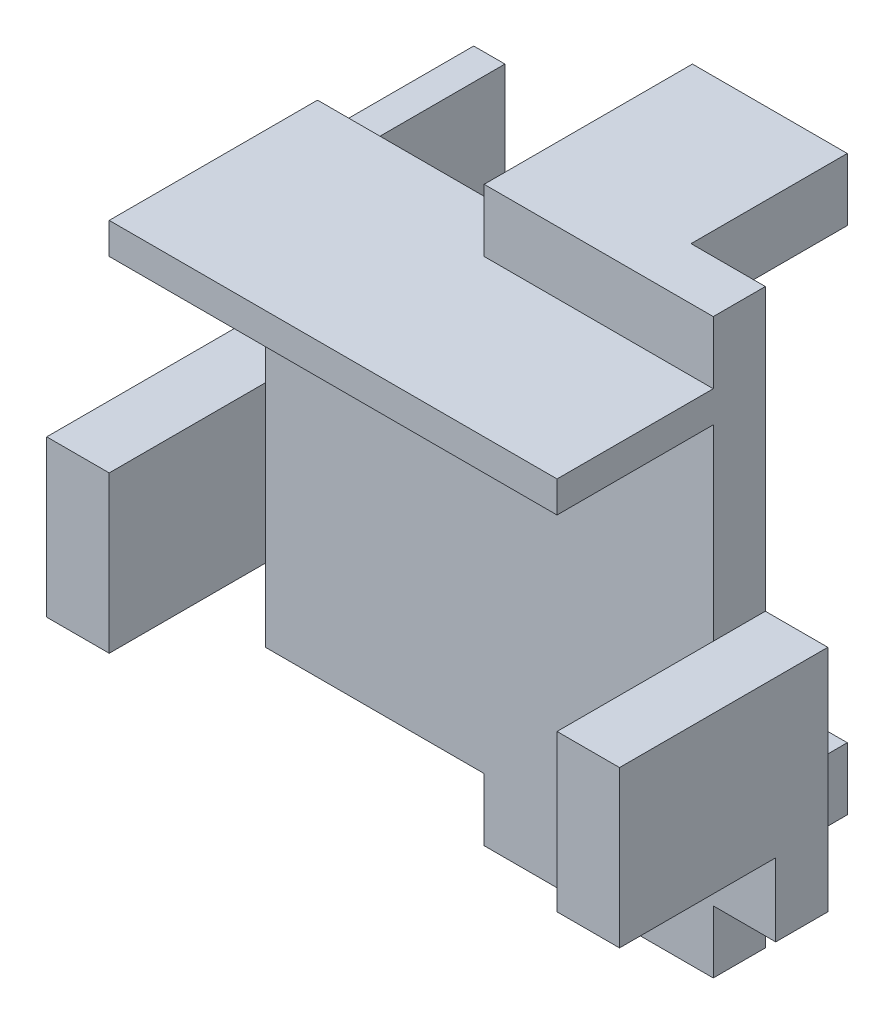
ISO-10303-21;
HEADER;
FILE_DESCRIPTION(('STEP AP214'),'2;1');
FILE_NAME('part.step','',(''),(''),'','','');
FILE_SCHEMA(('AUTOMOTIVE_DESIGN { 1 0 10303 214 1 1 1 1 }'));
ENDSEC;
DATA;
#1=APPLICATION_CONTEXT('core data for automotive mechanical design processes');
#2=APPLICATION_PROTOCOL_DEFINITION('international standard','automotive_design',2000,#1);
#3=PRODUCT_CONTEXT('',#1,'mechanical');
#4=PRODUCT('Part','Part','',(#3));
#5=PRODUCT_RELATED_PRODUCT_CATEGORY('part','',(#4));
#6=PRODUCT_DEFINITION_FORMATION('','',#4);
#7=PRODUCT_DEFINITION_CONTEXT('part definition',#1,'design');
#8=PRODUCT_DEFINITION('design','',#6,#7);
#9=PRODUCT_DEFINITION_SHAPE('','',#8);
#10=(LENGTH_UNIT() NAMED_UNIT(*) SI_UNIT(.MILLI.,.METRE.));
#11=(NAMED_UNIT(*) PLANE_ANGLE_UNIT() SI_UNIT($,.RADIAN.));
#12=(NAMED_UNIT(*) SI_UNIT($,.STERADIAN.) SOLID_ANGLE_UNIT());
#13=UNCERTAINTY_MEASURE_WITH_UNIT(LENGTH_MEASURE(1.E-05),#10,'distance_accuracy_value','');
#14=(GEOMETRIC_REPRESENTATION_CONTEXT(3) GLOBAL_UNCERTAINTY_ASSIGNED_CONTEXT((#13)) GLOBAL_UNIT_ASSIGNED_CONTEXT((#10,
#11,#12)) REPRESENTATION_CONTEXT('',''));
#15=CARTESIAN_POINT('',(0.,0.,0.));
#16=DIRECTION('',(0.,0.,1.));
#17=DIRECTION('',(1.,0.,0.));
#18=AXIS2_PLACEMENT_3D('',#15,#16,#17);
#19=CARTESIAN_POINT('',(0.,0.,-5.));
#20=DIRECTION('',(0.,0.,1.));
#21=DIRECTION('',(1.,0.,0.));
#22=AXIS2_PLACEMENT_3D('',#19,#20,#21);
#23=PLANE('',#22);
#24=DIRECTION('',(1.,0.,0.));
#25=VECTOR('',#24,1.);
#26=CARTESIAN_POINT('',(-50.7969593030904,9.03260576178203,-5.));
#27=LINE('',#26,#25);
#28=CARTESIAN_POINT('',(-50.7969593030904,9.03260576178203,-5.));
#29=VERTEX_POINT('',#28);
#30=CARTESIAN_POINT('',(-35.9278686997028,9.03260576178203,-5.));
#31=VERTEX_POINT('',#30);
#32=EDGE_CURVE('E700',#29,#31,#27,.T.);
#33=ORIENTED_EDGE('',*,*,#32,.F.);
#34=DIRECTION('',(1.,0.,0.));
#35=VECTOR('',#34,1.);
#36=CARTESIAN_POINT('',(0.,9.03260576178203,-5.));
#37=LINE('',#36,#35);
#38=CARTESIAN_POINT('',(-68.7969593030904,9.03260576178203,-5.));
#39=VERTEX_POINT('',#38);
#40=EDGE_CURVE('E370',#39,#29,#37,.T.);
#41=ORIENTED_EDGE('',*,*,#40,.F.);
#42=DIRECTION('',(0.,1.,0.));
#43=VECTOR('',#42,1.);
#44=CARTESIAN_POINT('',(-68.7969593030904,0.,-5.));
#45=LINE('',#44,#43);
#46=CARTESIAN_POINT('',(-68.7969593030904,49.032605761782,-5.));
#47=VERTEX_POINT('',#46);
#48=EDGE_CURVE('E44',#39,#47,#45,.T.);
#49=ORIENTED_EDGE('',*,*,#48,.T.);
#50=DIRECTION('',(-1.,0.,0.));
#51=VECTOR('',#50,1.);
#52=CARTESIAN_POINT('',(0.,49.032605761782,-5.));
#53=LINE('',#52,#51);
#54=CARTESIAN_POINT('',(-71.7969593030904,49.032605761782,-5.));
#55=VERTEX_POINT('',#54);
#56=EDGE_CURVE('E11',#47,#55,#53,.T.);
#57=ORIENTED_EDGE('',*,*,#56,.T.);
#58=DIRECTION('',(0.,1.,0.));
#59=VECTOR('',#58,1.);
#60=CARTESIAN_POINT('',(-71.7969593030904,0.,-5.));
#61=LINE('',#60,#59);
#62=CARTESIAN_POINT('',(-71.7969593030904,52.032605761782,-5.));
#63=VERTEX_POINT('',#62);
#64=EDGE_CURVE('E360',#55,#63,#61,.T.);
#65=ORIENTED_EDGE('',*,*,#64,.T.);
#66=DIRECTION('',(-1.,0.,0.));
#67=VECTOR('',#66,1.);
#68=CARTESIAN_POINT('',(0.,52.032605761782,-5.));
#69=LINE('',#68,#67);
#70=CARTESIAN_POINT('',(-50.7969593030904,52.032605761782,-5.));
#71=VERTEX_POINT('',#70);
#72=EDGE_CURVE('E356',#71,#63,#69,.T.);
#73=ORIENTED_EDGE('',*,*,#72,.F.);
#74=DIRECTION('',(-1.,0.,0.));
#75=VECTOR('',#74,1.);
#76=CARTESIAN_POINT('',(-35.9278686997028,52.032605761782,-5.));
#77=LINE('',#76,#75);
#78=CARTESIAN_POINT('',(-35.9278686997028,52.032605761782,-5.));
#79=VERTEX_POINT('',#78);
#80=EDGE_CURVE('E51',#79,#71,#77,.T.);
#81=ORIENTED_EDGE('',*,*,#80,.F.);
#82=DIRECTION('',(0.,-1.,0.));
#83=VECTOR('',#82,1.);
#84=CARTESIAN_POINT('',(-35.9278686997028,58.032605761782,-5.));
#85=LINE('',#84,#83);
#86=CARTESIAN_POINT('',(-35.9278686997028,58.032605761782,-5.));
#87=VERTEX_POINT('',#86);
#88=EDGE_CURVE('E261',#87,#79,#85,.T.);
#89=ORIENTED_EDGE('',*,*,#88,.F.);
#90=DIRECTION('',(1.,0.,0.));
#91=VECTOR('',#90,1.);
#92=CARTESIAN_POINT('',(0.,58.032605761782,-5.));
#93=LINE('',#92,#91);
#94=CARTESIAN_POINT('',(-28.7969593030904,58.032605761782,-5.));
#95=VERTEX_POINT('',#94);
#96=EDGE_CURVE('E354',#87,#95,#93,.T.);
#97=ORIENTED_EDGE('',*,*,#96,.T.);
#98=DIRECTION('',(0.,-1.,0.));
#99=VECTOR('',#98,1.);
#100=CARTESIAN_POINT('',(-28.7969593030904,0.,-5.));
#101=LINE('',#100,#99);
#102=CARTESIAN_POINT('',(-28.7969593030904,31.032605761782,-5.));
#103=VERTEX_POINT('',#102);
#104=EDGE_CURVE('E386',#95,#103,#101,.T.);
#105=ORIENTED_EDGE('',*,*,#104,.T.);
#106=DIRECTION('',(1.,0.,0.));
#107=VECTOR('',#106,1.);
#108=CARTESIAN_POINT('',(0.,31.032605761782,-5.));
#109=LINE('',#108,#107);
#110=CARTESIAN_POINT('',(-22.7969593030904,31.032605761782,-5.));
#111=VERTEX_POINT('',#110);
#112=EDGE_CURVE('E383',#103,#111,#109,.T.);
#113=ORIENTED_EDGE('',*,*,#112,.T.);
#114=DIRECTION('',(0.,-1.,0.));
#115=VECTOR('',#114,1.);
#116=CARTESIAN_POINT('',(-22.7969593030904,0.,-5.));
#117=LINE('',#116,#115);
#118=CARTESIAN_POINT('',(-22.7969593030904,9.03260576178203,-5.));
#119=VERTEX_POINT('',#118);
#120=EDGE_CURVE('E381',#111,#119,#117,.T.);
#121=ORIENTED_EDGE('',*,*,#120,.T.);
#122=DIRECTION('',(1.,0.,0.));
#123=VECTOR('',#122,1.);
#124=CARTESIAN_POINT('',(0.,9.03260576178203,-5.));
#125=LINE('',#124,#123);
#126=CARTESIAN_POINT('',(-28.7969593030904,9.03260576178203,-5.));
#127=VERTEX_POINT('',#126);
#128=EDGE_CURVE('E378',#127,#119,#125,.T.);
#129=ORIENTED_EDGE('',*,*,#128,.F.);
#130=DIRECTION('',(0.,-1.,0.));
#131=VECTOR('',#130,1.);
#132=CARTESIAN_POINT('',(-28.7969593030904,0.,-5.));
#133=LINE('',#132,#131);
#134=CARTESIAN_POINT('',(-28.7969593030904,3.03260576178203,-5.));
#135=VERTEX_POINT('',#134);
#136=EDGE_CURVE('E375',#127,#135,#133,.T.);
#137=ORIENTED_EDGE('',*,*,#136,.T.);
#138=DIRECTION('',(1.,0.,0.));
#139=VECTOR('',#138,1.);
#140=CARTESIAN_POINT('',(0.,3.03260576178202,-5.));
#141=LINE('',#140,#139);
#142=CARTESIAN_POINT('',(-35.9278686997028,3.03260576178203,-5.));
#143=VERTEX_POINT('',#142);
#144=EDGE_CURVE('E373',#143,#135,#141,.T.);
#145=ORIENTED_EDGE('',*,*,#144,.F.);
#146=DIRECTION('',(0.,-1.,0.));
#147=VECTOR('',#146,1.);
#148=CARTESIAN_POINT('',(-35.9278686997028,9.03260576178203,-5.));
#149=LINE('',#148,#147);
#150=EDGE_CURVE('E254',#31,#143,#149,.T.);
#151=ORIENTED_EDGE('',*,*,#150,.F.);
#152=EDGE_LOOP('',(#33,#41,#49,#57,#65,#73,#81,#89,#97,#105,#113,#121,#129,#137,#145,#151));
#153=FACE_BOUND('',#152,.T.);
#154=ADVANCED_FACE('F36',(#153),#23,.F.);
#155=DIRECTION('',(0.,1.,0.));
#156=VECTOR('',#155,1.);
#157=CARTESIAN_POINT('',(-71.7969593030904,0.,-5.));
#158=LINE('',#157,#156);
#159=CARTESIAN_POINT('',(-71.7969593030904,16.032605761782,-5.));
#160=VERTEX_POINT('',#159);
#161=CARTESIAN_POINT('',(-71.7969593030904,31.032605761782,-5.));
#162=VERTEX_POINT('',#161);
#163=EDGE_CURVE('E447',#160,#162,#158,.T.);
#164=ORIENTED_EDGE('',*,*,#163,.F.);
#165=DIRECTION('',(1.,0.,0.));
#166=VECTOR('',#165,1.);
#167=CARTESIAN_POINT('',(0.,16.032605761782,-5.));
#168=LINE('',#167,#166);
#169=CARTESIAN_POINT('',(-77.7969593030904,16.032605761782,-5.));
#170=VERTEX_POINT('',#169);
#171=EDGE_CURVE('E367',#170,#160,#168,.T.);
#172=ORIENTED_EDGE('',*,*,#171,.F.);
#173=DIRECTION('',(0.,-1.,0.));
#174=VECTOR('',#173,1.);
#175=CARTESIAN_POINT('',(-77.7969593030904,0.,-5.));
#176=LINE('',#175,#174);
#177=CARTESIAN_POINT('',(-77.7969593030904,31.032605761782,-5.));
#178=VERTEX_POINT('',#177);
#179=EDGE_CURVE('E364',#178,#170,#176,.T.);
#180=ORIENTED_EDGE('',*,*,#179,.F.);
#181=DIRECTION('',(1.,0.,0.));
#182=VECTOR('',#181,1.);
#183=CARTESIAN_POINT('',(0.,31.032605761782,-5.));
#184=LINE('',#183,#182);
#185=EDGE_CURVE('E362',#178,#162,#184,.T.);
#186=ORIENTED_EDGE('',*,*,#185,.T.);
#187=EDGE_LOOP('',(#164,#172,#180,#186));
#188=FACE_BOUND('',#187,.T.);
#189=ADVANCED_FACE('F467',(#188),#23,.F.);
#190=CARTESIAN_POINT('',(0.,0.,0.));
#191=DIRECTION('',(0.,0.,1.));
#192=DIRECTION('',(1.,0.,0.));
#193=AXIS2_PLACEMENT_3D('',#190,#191,#192);
#194=PLANE('',#193);
#195=DIRECTION('',(0.,-1.,0.));
#196=VECTOR('',#195,1.);
#197=CARTESIAN_POINT('',(-50.7969593030904,0.,0.));
#198=LINE('',#197,#196);
#199=CARTESIAN_POINT('',(-50.7969593030904,58.032605761782,0.));
#200=VERTEX_POINT('',#199);
#201=CARTESIAN_POINT('',(-50.7969593030904,52.032605761782,0.));
#202=VERTEX_POINT('',#201);
#203=EDGE_CURVE('E391',#200,#202,#198,.T.);
#204=ORIENTED_EDGE('',*,*,#203,.T.);
#205=DIRECTION('',(-1.,0.,0.));
#206=VECTOR('',#205,1.);
#207=CARTESIAN_POINT('',(0.,52.032605761782,0.));
#208=LINE('',#207,#206);
#209=CARTESIAN_POINT('',(-28.7969593030904,52.032605761782,0.));
#210=VERTEX_POINT('',#209);
#211=EDGE_CURVE('E313',#210,#202,#208,.T.);
#212=ORIENTED_EDGE('',*,*,#211,.F.);
#213=DIRECTION('',(0.,-1.,0.));
#214=VECTOR('',#213,1.);
#215=CARTESIAN_POINT('',(-28.7969593030904,0.,0.));
#216=LINE('',#215,#214);
#217=CARTESIAN_POINT('',(-28.7969593030904,58.032605761782,0.));
#218=VERTEX_POINT('',#217);
#219=EDGE_CURVE('E357',#218,#210,#216,.T.);
#220=ORIENTED_EDGE('',*,*,#219,.F.);
#221=DIRECTION('',(1.,0.,0.));
#222=VECTOR('',#221,1.);
#223=CARTESIAN_POINT('',(0.,58.032605761782,0.));
#224=LINE('',#223,#222);
#225=EDGE_CURVE('E353',#200,#218,#224,.T.);
#226=ORIENTED_EDGE('',*,*,#225,.F.);
#227=EDGE_LOOP('',(#204,#212,#220,#226));
#228=FACE_BOUND('',#227,.T.);
#229=ADVANCED_FACE('F490',(#228),#194,.T.);
#230=CARTESIAN_POINT('',(-28.7969593030904,16.032605761782,15.));
#231=DIRECTION('',(0.,1.,0.));
#232=DIRECTION('',(0.,0.,1.));
#233=AXIS2_PLACEMENT_3D('',#230,#231,#232);
#234=PLANE('',#233);
#235=DIRECTION('',(1.,0.,0.));
#236=VECTOR('',#235,1.);
#237=CARTESIAN_POINT('',(-28.7969593030904,16.032605761782,0.));
#238=LINE('',#237,#236);
#239=CARTESIAN_POINT('',(-28.7969593030904,16.032605761782,0.));
#240=VERTEX_POINT('',#239);
#241=CARTESIAN_POINT('',(-22.7969593030904,16.032605761782,0.));
#242=VERTEX_POINT('',#241);
#243=EDGE_CURVE('E438',#240,#242,#238,.T.);
#244=ORIENTED_EDGE('',*,*,#243,.T.);
#245=DIRECTION('',(0.,0.,-1.));
#246=VECTOR('',#245,1.);
#247=CARTESIAN_POINT('',(-22.7969593030904,16.032605761782,15.));
#248=LINE('',#247,#246);
#249=CARTESIAN_POINT('',(-22.7969593030904,16.032605761782,15.));
#250=VERTEX_POINT('',#249);
#251=EDGE_CURVE('E445',#250,#242,#248,.T.);
#252=ORIENTED_EDGE('',*,*,#251,.F.);
#253=DIRECTION('',(1.,0.,0.));
#254=VECTOR('',#253,1.);
#255=CARTESIAN_POINT('',(-28.7969593030904,16.032605761782,15.));
#256=LINE('',#255,#254);
#257=CARTESIAN_POINT('',(-28.7969593030904,16.032605761782,15.));
#258=VERTEX_POINT('',#257);
#259=EDGE_CURVE('E423',#258,#250,#256,.T.);
#260=ORIENTED_EDGE('',*,*,#259,.F.);
#261=DIRECTION('',(0.,0.,-1.));
#262=VECTOR('',#261,1.);
#263=CARTESIAN_POINT('',(-28.7969593030904,16.032605761782,15.));
#264=LINE('',#263,#262);
#265=EDGE_CURVE('E435',#258,#240,#264,.T.);
#266=ORIENTED_EDGE('',*,*,#265,.T.);
#267=EDGE_LOOP('',(#244,#252,#260,#266));
#268=FACE_BOUND('',#267,.T.);
#269=ADVANCED_FACE('F38',(#268),#234,.F.);
#270=CARTESIAN_POINT('',(-22.7969593030904,31.032605761782,15.));
#271=DIRECTION('',(1.,0.,0.));
#272=DIRECTION('',(0.,0.,-1.));
#273=AXIS2_PLACEMENT_3D('',#270,#271,#272);
#274=PLANE('',#273);
#275=ORIENTED_EDGE('',*,*,#251,.T.);
#276=DIRECTION('',(0.,-1.,0.));
#277=VECTOR('',#276,1.);
#278=CARTESIAN_POINT('',(-22.7969593030904,0.,0.));
#279=LINE('',#278,#277);
#280=CARTESIAN_POINT('',(-22.7969593030904,9.03260576178203,0.));
#281=VERTEX_POINT('',#280);
#282=EDGE_CURVE('E414',#242,#281,#279,.T.);
#283=ORIENTED_EDGE('',*,*,#282,.T.);
#284=DIRECTION('',(0.,0.,1.));
#285=VECTOR('',#284,1.);
#286=CARTESIAN_POINT('',(-22.7969593030904,9.03260576178203,-5.));
#287=LINE('',#286,#285);
#288=EDGE_CURVE('E681',#119,#281,#287,.T.);
#289=ORIENTED_EDGE('',*,*,#288,.F.);
#290=ORIENTED_EDGE('',*,*,#120,.F.);
#291=DIRECTION('',(0.,0.,-1.));
#292=VECTOR('',#291,1.);
#293=CARTESIAN_POINT('',(-22.7969593030904,31.032605761782,15.));
#294=LINE('',#293,#292);
#295=CARTESIAN_POINT('',(-22.7969593030904,31.032605761782,15.));
#296=VERTEX_POINT('',#295);
#297=EDGE_CURVE('E443',#296,#111,#294,.T.);
#298=ORIENTED_EDGE('',*,*,#297,.F.);
#299=DIRECTION('',(0.,-1.,0.));
#300=VECTOR('',#299,1.);
#301=CARTESIAN_POINT('',(-22.7969593030904,31.032605761782,15.));
#302=LINE('',#301,#300);
#303=EDGE_CURVE('E425',#296,#250,#302,.T.);
#304=ORIENTED_EDGE('',*,*,#303,.T.);
#305=EDGE_LOOP('',(#275,#283,#289,#290,#298,#304));
#306=FACE_BOUND('',#305,.T.);
#307=ADVANCED_FACE('F718',(#306),#274,.T.);
#308=CARTESIAN_POINT('',(-28.7969593030904,31.032605761782,15.));
#309=DIRECTION('',(0.,1.,0.));
#310=DIRECTION('',(0.,0.,1.));
#311=AXIS2_PLACEMENT_3D('',#308,#309,#310);
#312=PLANE('',#311);
#313=ORIENTED_EDGE('',*,*,#297,.T.);
#314=ORIENTED_EDGE('',*,*,#112,.F.);
#315=DIRECTION('',(0.,0.,1.));
#316=VECTOR('',#315,1.);
#317=CARTESIAN_POINT('',(-28.7969593030904,31.032605761782,-5.));
#318=LINE('',#317,#316);
#319=CARTESIAN_POINT('',(-28.7969593030904,31.032605761782,0.));
#320=VERTEX_POINT('',#319);
#321=EDGE_CURVE('E679',#103,#320,#318,.T.);
#322=ORIENTED_EDGE('',*,*,#321,.T.);
#323=DIRECTION('',(0.,0.,-1.));
#324=VECTOR('',#323,1.);
#325=CARTESIAN_POINT('',(-28.7969593030904,31.032605761782,15.));
#326=LINE('',#325,#324);
#327=CARTESIAN_POINT('',(-28.7969593030904,31.032605761782,15.));
#328=VERTEX_POINT('',#327);
#329=EDGE_CURVE('E440',#328,#320,#326,.T.);
#330=ORIENTED_EDGE('',*,*,#329,.F.);
#331=DIRECTION('',(1.,0.,0.));
#332=VECTOR('',#331,1.);
#333=CARTESIAN_POINT('',(-28.7969593030904,31.032605761782,15.));
#334=LINE('',#333,#332);
#335=EDGE_CURVE('E429',#328,#296,#334,.T.);
#336=ORIENTED_EDGE('',*,*,#335,.T.);
#337=EDGE_LOOP('',(#313,#314,#322,#330,#336));
#338=FACE_BOUND('',#337,.T.);
#339=ADVANCED_FACE('F729',(#338),#312,.T.);
#340=CARTESIAN_POINT('',(-28.7969593030904,16.032605761782,15.));
#341=DIRECTION('',(-1.,0.,0.));
#342=DIRECTION('',(0.,0.,1.));
#343=AXIS2_PLACEMENT_3D('',#340,#341,#342);
#344=PLANE('',#343);
#345=DIRECTION('',(0.,1.,0.));
#346=VECTOR('',#345,1.);
#347=CARTESIAN_POINT('',(-28.7969593030904,16.032605761782,0.));
#348=LINE('',#347,#346);
#349=EDGE_CURVE('E426',#240,#320,#348,.T.);
#350=ORIENTED_EDGE('',*,*,#349,.F.);
#351=ORIENTED_EDGE('',*,*,#265,.F.);
#352=DIRECTION('',(0.,1.,0.));
#353=VECTOR('',#352,1.);
#354=CARTESIAN_POINT('',(-28.7969593030904,16.032605761782,15.));
#355=LINE('',#354,#353);
#356=EDGE_CURVE('E432',#258,#328,#355,.T.);
#357=ORIENTED_EDGE('',*,*,#356,.T.);
#358=ORIENTED_EDGE('',*,*,#329,.T.);
#359=EDGE_LOOP('',(#350,#351,#357,#358));
#360=FACE_BOUND('',#359,.T.);
#361=ADVANCED_FACE('F726',(#360),#344,.T.);
#362=CARTESIAN_POINT('',(0.,0.,15.));
#363=DIRECTION('',(0.,0.,-1.));
#364=DIRECTION('',(-1.,0.,0.));
#365=AXIS2_PLACEMENT_3D('',#362,#363,#364);
#366=PLANE('',#365);
#367=ORIENTED_EDGE('',*,*,#259,.T.);
#368=ORIENTED_EDGE('',*,*,#303,.F.);
#369=ORIENTED_EDGE('',*,*,#335,.F.);
#370=ORIENTED_EDGE('',*,*,#356,.F.);
#371=EDGE_LOOP('',(#367,#368,#369,#370));
#372=FACE_BOUND('',#371,.T.);
#373=ADVANCED_FACE('F518',(#372),#366,.F.);
#374=DIRECTION('',(-1.,0.,0.));
#375=VECTOR('',#374,1.);
#376=CARTESIAN_POINT('',(0.,49.032605761782,0.));
#377=LINE('',#376,#375);
#378=CARTESIAN_POINT('',(-28.7969593030904,49.032605761782,0.));
#379=VERTEX_POINT('',#378);
#380=CARTESIAN_POINT('',(-71.7969593030904,49.032605761782,0.));
#381=VERTEX_POINT('',#380);
#382=EDGE_CURVE('E303',#379,#381,#377,.T.);
#383=ORIENTED_EDGE('',*,*,#382,.T.);
#384=DIRECTION('',(0.,1.,0.));
#385=VECTOR('',#384,1.);
#386=CARTESIAN_POINT('',(-71.7969593030904,0.,0.));
#387=LINE('',#386,#385);
#388=CARTESIAN_POINT('',(-71.7969593030904,31.032605761782,0.));
#389=VERTEX_POINT('',#388);
#390=EDGE_CURVE('E394',#389,#381,#387,.T.);
#391=ORIENTED_EDGE('',*,*,#390,.F.);
#392=DIRECTION('',(0.,-1.,0.));
#393=VECTOR('',#392,1.);
#394=CARTESIAN_POINT('',(-71.7969593030904,0.,0.));
#395=LINE('',#394,#393);
#396=CARTESIAN_POINT('',(-71.7969593030904,16.032605761782,0.));
#397=VERTEX_POINT('',#396);
#398=EDGE_CURVE('E334',#389,#397,#395,.T.);
#399=ORIENTED_EDGE('',*,*,#398,.T.);
#400=DIRECTION('',(0.,1.,0.));
#401=VECTOR('',#400,1.);
#402=CARTESIAN_POINT('',(-71.7969593030904,0.,0.));
#403=LINE('',#402,#401);
#404=CARTESIAN_POINT('',(-71.7969593030904,9.03260576178203,0.));
#405=VERTEX_POINT('',#404);
#406=EDGE_CURVE('E397',#405,#397,#403,.T.);
#407=ORIENTED_EDGE('',*,*,#406,.F.);
#408=DIRECTION('',(1.,0.,0.));
#409=VECTOR('',#408,1.);
#410=CARTESIAN_POINT('',(0.,9.03260576178203,0.));
#411=LINE('',#410,#409);
#412=CARTESIAN_POINT('',(-50.7969593030904,9.03260576178203,0.));
#413=VERTEX_POINT('',#412);
#414=EDGE_CURVE('E400',#405,#413,#411,.T.);
#415=ORIENTED_EDGE('',*,*,#414,.T.);
#416=DIRECTION('',(0.,-1.,0.));
#417=VECTOR('',#416,1.);
#418=CARTESIAN_POINT('',(-50.7969593030904,0.,0.));
#419=LINE('',#418,#417);
#420=CARTESIAN_POINT('',(-50.7969593030904,3.03260576178203,0.));
#421=VERTEX_POINT('',#420);
#422=EDGE_CURVE('E402',#413,#421,#419,.T.);
#423=ORIENTED_EDGE('',*,*,#422,.T.);
#424=DIRECTION('',(1.,0.,0.));
#425=VECTOR('',#424,1.);
#426=CARTESIAN_POINT('',(0.,3.03260576178202,0.));
#427=LINE('',#426,#425);
#428=CARTESIAN_POINT('',(-28.7969593030904,3.03260576178203,0.));
#429=VERTEX_POINT('',#428);
#430=EDGE_CURVE('E405',#421,#429,#427,.T.);
#431=ORIENTED_EDGE('',*,*,#430,.T.);
#432=DIRECTION('',(0.,-1.,0.));
#433=VECTOR('',#432,1.);
#434=CARTESIAN_POINT('',(-28.7969593030904,0.,0.));
#435=LINE('',#434,#433);
#436=CARTESIAN_POINT('',(-28.7969593030904,9.03260576178203,0.));
#437=VERTEX_POINT('',#436);
#438=EDGE_CURVE('E408',#437,#429,#435,.T.);
#439=ORIENTED_EDGE('',*,*,#438,.F.);
#440=DIRECTION('',(1.,0.,0.));
#441=VECTOR('',#440,1.);
#442=CARTESIAN_POINT('',(0.,9.03260576178203,0.));
#443=LINE('',#442,#441);
#444=EDGE_CURVE('E411',#437,#281,#443,.T.);
#445=ORIENTED_EDGE('',*,*,#444,.T.);
#446=ORIENTED_EDGE('',*,*,#282,.F.);
#447=ORIENTED_EDGE('',*,*,#243,.F.);
#448=ORIENTED_EDGE('',*,*,#349,.T.);
#449=EDGE_CURVE('E421',#379,#320,#216,.T.);
#450=ORIENTED_EDGE('',*,*,#449,.F.);
#451=EDGE_LOOP('',(#383,#391,#399,#407,#415,#423,#431,#439,#445,#446,#447,#448,#450));
#452=FACE_BOUND('',#451,.T.);
#453=ADVANCED_FACE('F515',(#452),#194,.T.);
#454=CARTESIAN_POINT('',(0.,58.032605761782,-5.));
#455=DIRECTION('',(0.,-1.,0.));
#456=DIRECTION('',(0.,0.,-1.));
#457=AXIS2_PLACEMENT_3D('',#454,#455,#456);
#458=PLANE('',#457);
#459=ORIENTED_EDGE('',*,*,#225,.T.);
#460=DIRECTION('',(0.,0.,1.));
#461=VECTOR('',#460,1.);
#462=CARTESIAN_POINT('',(-28.7969593030904,58.032605761782,-5.));
#463=LINE('',#462,#461);
#464=EDGE_CURVE('E452',#95,#218,#463,.T.);
#465=ORIENTED_EDGE('',*,*,#464,.F.);
#466=ORIENTED_EDGE('',*,*,#96,.F.);
#467=DIRECTION('',(0.,0.,1.));
#468=VECTOR('',#467,1.);
#469=CARTESIAN_POINT('',(-35.9278686997028,58.032605761782,-20.));
#470=LINE('',#469,#468);
#471=CARTESIAN_POINT('',(-35.9278686997028,58.032605761782,-20.));
#472=VERTEX_POINT('',#471);
#473=EDGE_CURVE('E278',#472,#87,#470,.T.);
#474=ORIENTED_EDGE('',*,*,#473,.F.);
#475=DIRECTION('',(1.,0.,0.));
#476=VECTOR('',#475,1.);
#477=CARTESIAN_POINT('',(-35.9278686997028,58.032605761782,-20.));
#478=LINE('',#477,#476);
#479=CARTESIAN_POINT('',(-50.7969593030904,58.032605761782,-20.));
#480=VERTEX_POINT('',#479);
#481=EDGE_CURVE('E277',#480,#472,#478,.T.);
#482=ORIENTED_EDGE('',*,*,#481,.F.);
#483=DIRECTION('',(0.,0.,1.));
#484=VECTOR('',#483,1.);
#485=CARTESIAN_POINT('',(-50.7969593030904,58.032605761782,-5.));
#486=LINE('',#485,#484);
#487=EDGE_CURVE('E388',#480,#200,#486,.T.);
#488=ORIENTED_EDGE('',*,*,#487,.T.);
#489=EDGE_LOOP('',(#459,#465,#466,#474,#482,#488));
#490=FACE_BOUND('',#489,.T.);
#491=ADVANCED_FACE('F485',(#490),#458,.F.);
#492=CARTESIAN_POINT('',(-28.7969593030904,0.,-5.));
#493=DIRECTION('',(-1.,0.,0.));
#494=DIRECTION('',(0.,-1.,0.));
#495=AXIS2_PLACEMENT_3D('',#492,#493,#494);
#496=PLANE('',#495);
#497=ORIENTED_EDGE('',*,*,#219,.T.);
#498=DIRECTION('',(0.,0.,-1.));
#499=VECTOR('',#498,1.);
#500=CARTESIAN_POINT('',(-28.7969593030904,52.032605761782,15.));
#501=LINE('',#500,#499);
#502=CARTESIAN_POINT('',(-28.7969593030904,52.032605761782,15.));
#503=VERTEX_POINT('',#502);
#504=EDGE_CURVE('E322',#503,#210,#501,.T.);
#505=ORIENTED_EDGE('',*,*,#504,.F.);
#506=DIRECTION('',(0.,-1.,0.));
#507=VECTOR('',#506,1.);
#508=CARTESIAN_POINT('',(-28.7969593030904,0.,15.));
#509=LINE('',#508,#507);
#510=CARTESIAN_POINT('',(-28.7969593030904,49.032605761782,15.));
#511=VERTEX_POINT('',#510);
#512=EDGE_CURVE('E316',#503,#511,#509,.T.);
#513=ORIENTED_EDGE('',*,*,#512,.T.);
#514=DIRECTION('',(0.,0.,-1.));
#515=VECTOR('',#514,1.);
#516=CARTESIAN_POINT('',(-28.7969593030904,49.032605761782,15.));
#517=LINE('',#516,#515);
#518=EDGE_CURVE('E328',#511,#379,#517,.T.);
#519=ORIENTED_EDGE('',*,*,#518,.T.);
#520=ORIENTED_EDGE('',*,*,#449,.T.);
#521=ORIENTED_EDGE('',*,*,#321,.F.);
#522=ORIENTED_EDGE('',*,*,#104,.F.);
#523=ORIENTED_EDGE('',*,*,#464,.T.);
#524=EDGE_LOOP('',(#497,#505,#513,#519,#520,#521,#522,#523));
#525=FACE_BOUND('',#524,.T.);
#526=ADVANCED_FACE('F520',(#525),#496,.F.);
#527=CARTESIAN_POINT('',(0.,9.03260576178203,-5.));
#528=DIRECTION('',(0.,-1.,0.));
#529=DIRECTION('',(0.,0.,-1.));
#530=AXIS2_PLACEMENT_3D('',#527,#528,#529);
#531=PLANE('',#530);
#532=ORIENTED_EDGE('',*,*,#444,.F.);
#533=DIRECTION('',(0.,0.,1.));
#534=VECTOR('',#533,1.);
#535=CARTESIAN_POINT('',(-28.7969593030904,9.03260576178203,-5.));
#536=LINE('',#535,#534);
#537=EDGE_CURVE('E686',#127,#437,#536,.T.);
#538=ORIENTED_EDGE('',*,*,#537,.F.);
#539=ORIENTED_EDGE('',*,*,#128,.T.);
#540=ORIENTED_EDGE('',*,*,#288,.T.);
#541=EDGE_LOOP('',(#532,#538,#539,#540));
#542=FACE_BOUND('',#541,.T.);
#543=ADVANCED_FACE('F523',(#542),#531,.T.);
#544=CARTESIAN_POINT('',(-28.7969593030904,0.,-5.));
#545=DIRECTION('',(-1.,0.,0.));
#546=DIRECTION('',(0.,-1.,0.));
#547=AXIS2_PLACEMENT_3D('',#544,#545,#546);
#548=PLANE('',#547);
#549=ORIENTED_EDGE('',*,*,#438,.T.);
#550=DIRECTION('',(0.,0.,1.));
#551=VECTOR('',#550,1.);
#552=CARTESIAN_POINT('',(-28.7969593030904,3.03260576178203,-5.));
#553=LINE('',#552,#551);
#554=EDGE_CURVE('E688',#135,#429,#553,.T.);
#555=ORIENTED_EDGE('',*,*,#554,.F.);
#556=ORIENTED_EDGE('',*,*,#136,.F.);
#557=ORIENTED_EDGE('',*,*,#537,.T.);
#558=EDGE_LOOP('',(#549,#555,#556,#557));
#559=FACE_BOUND('',#558,.T.);
#560=ADVANCED_FACE('F527',(#559),#548,.F.);
#561=CARTESIAN_POINT('',(0.,3.03260576178202,-5.));
#562=DIRECTION('',(0.,-1.,0.));
#563=DIRECTION('',(1.,0.,0.));
#564=AXIS2_PLACEMENT_3D('',#561,#562,#563);
#565=PLANE('',#564);
#566=ORIENTED_EDGE('',*,*,#430,.F.);
#567=DIRECTION('',(0.,0.,1.));
#568=VECTOR('',#567,1.);
#569=CARTESIAN_POINT('',(-50.7969593030904,3.03260576178203,-5.));
#570=LINE('',#569,#568);
#571=CARTESIAN_POINT('',(-50.7969593030904,3.03260576178203,-20.));
#572=VERTEX_POINT('',#571);
#573=EDGE_CURVE('E690',#572,#421,#570,.T.);
#574=ORIENTED_EDGE('',*,*,#573,.F.);
#575=DIRECTION('',(-1.,0.,0.));
#576=VECTOR('',#575,1.);
#577=CARTESIAN_POINT('',(-50.7969593030904,3.03260576178203,-20.));
#578=LINE('',#577,#576);
#579=CARTESIAN_POINT('',(-35.9278686997028,3.03260576178203,-20.));
#580=VERTEX_POINT('',#579);
#581=EDGE_CURVE('E252',#580,#572,#578,.T.);
#582=ORIENTED_EDGE('',*,*,#581,.F.);
#583=DIRECTION('',(0.,0.,1.));
#584=VECTOR('',#583,1.);
#585=CARTESIAN_POINT('',(-35.9278686997028,3.03260576178203,-20.));
#586=LINE('',#585,#584);
#587=EDGE_CURVE('E265',#580,#143,#586,.T.);
#588=ORIENTED_EDGE('',*,*,#587,.T.);
#589=ORIENTED_EDGE('',*,*,#144,.T.);
#590=ORIENTED_EDGE('',*,*,#554,.T.);
#591=EDGE_LOOP('',(#566,#574,#582,#588,#589,#590));
#592=FACE_BOUND('',#591,.T.);
#593=ADVANCED_FACE('F531',(#592),#565,.T.);
#594=CARTESIAN_POINT('',(-50.7969593030904,0.,-5.));
#595=DIRECTION('',(-1.,0.,0.));
#596=DIRECTION('',(0.,0.,1.));
#597=AXIS2_PLACEMENT_3D('',#594,#595,#596);
#598=PLANE('',#597);
#599=ORIENTED_EDGE('',*,*,#422,.F.);
#600=DIRECTION('',(0.,0.,1.));
#601=VECTOR('',#600,1.);
#602=CARTESIAN_POINT('',(-50.7969593030904,9.03260576178203,-5.));
#603=LINE('',#602,#601);
#604=EDGE_CURVE('E260',#29,#413,#603,.T.);
#605=ORIENTED_EDGE('',*,*,#604,.F.);
#606=DIRECTION('',(0.,0.,1.));
#607=VECTOR('',#606,1.);
#608=CARTESIAN_POINT('',(-50.7969593030904,9.03260576178203,-20.));
#609=LINE('',#608,#607);
#610=CARTESIAN_POINT('',(-50.7969593030904,9.03260576178203,-20.));
#611=VERTEX_POINT('',#610);
#612=EDGE_CURVE('E239',#611,#29,#609,.T.);
#613=ORIENTED_EDGE('',*,*,#612,.F.);
#614=DIRECTION('',(0.,1.,0.));
#615=VECTOR('',#614,1.);
#616=CARTESIAN_POINT('',(-50.7969593030904,9.03260576178203,-20.));
#617=LINE('',#616,#615);
#618=EDGE_CURVE('E246',#572,#611,#617,.T.);
#619=ORIENTED_EDGE('',*,*,#618,.F.);
#620=ORIENTED_EDGE('',*,*,#573,.T.);
#621=EDGE_LOOP('',(#599,#605,#613,#619,#620));
#622=FACE_BOUND('',#621,.T.);
#623=ADVANCED_FACE('F258',(#622),#598,.T.);
#624=CARTESIAN_POINT('',(0.,9.03260576178203,-5.));
#625=DIRECTION('',(0.,-1.,0.));
#626=DIRECTION('',(0.,0.,-1.));
#627=AXIS2_PLACEMENT_3D('',#624,#625,#626);
#628=PLANE('',#627);
#629=ORIENTED_EDGE('',*,*,#604,.T.);
#630=ORIENTED_EDGE('',*,*,#414,.F.);
#631=DIRECTION('',(0.,0.,1.));
#632=VECTOR('',#631,1.);
#633=CARTESIAN_POINT('',(-71.7969593030904,9.03260576178203,-5.));
#634=LINE('',#633,#632);
#635=CARTESIAN_POINT('',(-71.7969593030904,9.03260576178203,-20.));
#636=VERTEX_POINT('',#635);
#637=EDGE_CURVE('E693',#636,#405,#634,.T.);
#638=ORIENTED_EDGE('',*,*,#637,.F.);
#639=DIRECTION('',(-1.,0.,0.));
#640=VECTOR('',#639,1.);
#641=CARTESIAN_POINT('',(-68.7969593030904,9.03260576178203,-20.));
#642=LINE('',#641,#640);
#643=CARTESIAN_POINT('',(-68.7969593030904,9.03260576178203,-20.));
#644=VERTEX_POINT('',#643);
#645=EDGE_CURVE('E293',#644,#636,#642,.T.);
#646=ORIENTED_EDGE('',*,*,#645,.F.);
#647=DIRECTION('',(0.,0.,1.));
#648=VECTOR('',#647,1.);
#649=CARTESIAN_POINT('',(-68.7969593030904,9.03260576178203,-20.));
#650=LINE('',#649,#648);
#651=EDGE_CURVE('E304',#644,#39,#650,.T.);
#652=ORIENTED_EDGE('',*,*,#651,.T.);
#653=ORIENTED_EDGE('',*,*,#40,.T.);
#654=EDGE_LOOP('',(#629,#630,#638,#646,#652,#653));
#655=FACE_BOUND('',#654,.T.);
#656=ADVANCED_FACE('F538',(#655),#628,.T.);
#657=CARTESIAN_POINT('',(-71.7969593030904,0.,-5.));
#658=DIRECTION('',(1.,0.,0.));
#659=DIRECTION('',(0.,0.,-1.));
#660=AXIS2_PLACEMENT_3D('',#657,#658,#659);
#661=PLANE('',#660);
#662=ORIENTED_EDGE('',*,*,#406,.T.);
#663=DIRECTION('',(0.,0.,1.));
#664=VECTOR('',#663,1.);
#665=CARTESIAN_POINT('',(-71.7969593030904,16.032605761782,-5.));
#666=LINE('',#665,#664);
#667=EDGE_CURVE('E464',#160,#397,#666,.T.);
#668=ORIENTED_EDGE('',*,*,#667,.F.);
#669=ORIENTED_EDGE('',*,*,#163,.T.);
#670=DIRECTION('',(0.,0.,1.));
#671=VECTOR('',#670,1.);
#672=CARTESIAN_POINT('',(-71.7969593030904,31.032605761782,-5.));
#673=LINE('',#672,#671);
#674=EDGE_CURVE('E461',#162,#389,#673,.T.);
#675=ORIENTED_EDGE('',*,*,#674,.T.);
#676=ORIENTED_EDGE('',*,*,#390,.T.);
#677=DIRECTION('',(0.,0.,-1.));
#678=VECTOR('',#677,1.);
#679=CARTESIAN_POINT('',(-71.7969593030904,49.032605761782,15.));
#680=LINE('',#679,#678);
#681=CARTESIAN_POINT('',(-71.7969593030904,49.032605761782,15.));
#682=VERTEX_POINT('',#681);
#683=EDGE_CURVE('E331',#682,#381,#680,.T.);
#684=ORIENTED_EDGE('',*,*,#683,.F.);
#685=DIRECTION('',(0.,1.,0.));
#686=VECTOR('',#685,1.);
#687=CARTESIAN_POINT('',(-71.7969593030904,0.,15.));
#688=LINE('',#687,#686);
#689=CARTESIAN_POINT('',(-71.7969593030904,52.032605761782,15.));
#690=VERTEX_POINT('',#689);
#691=EDGE_CURVE('E309',#682,#690,#688,.T.);
#692=ORIENTED_EDGE('',*,*,#691,.T.);
#693=DIRECTION('',(0.,0.,1.));
#694=VECTOR('',#693,1.);
#695=CARTESIAN_POINT('',(-71.7969593030904,52.032605761782,-5.));
#696=LINE('',#695,#694);
#697=EDGE_CURVE('E473',#63,#690,#696,.T.);
#698=ORIENTED_EDGE('',*,*,#697,.F.);
#699=ORIENTED_EDGE('',*,*,#64,.F.);
#700=DIRECTION('',(0.,0.,1.));
#701=VECTOR('',#700,1.);
#702=CARTESIAN_POINT('',(-71.7969593030904,49.032605761782,-20.));
#703=LINE('',#702,#701);
#704=CARTESIAN_POINT('',(-71.7969593030904,49.032605761782,-20.));
#705=VERTEX_POINT('',#704);
#706=EDGE_CURVE('E299',#705,#55,#703,.T.);
#707=ORIENTED_EDGE('',*,*,#706,.F.);
#708=DIRECTION('',(0.,1.,0.));
#709=VECTOR('',#708,1.);
#710=CARTESIAN_POINT('',(-71.7969593030904,9.03260576178203,-20.));
#711=LINE('',#710,#709);
#712=EDGE_CURVE('E291',#636,#705,#711,.T.);
#713=ORIENTED_EDGE('',*,*,#712,.F.);
#714=ORIENTED_EDGE('',*,*,#637,.T.);
#715=EDGE_LOOP('',(#662,#668,#669,#675,#676,#684,#692,#698,#699,#707,#713,#714));
#716=FACE_BOUND('',#715,.T.);
#717=ADVANCED_FACE('F459',(#716),#661,.F.);
#718=CARTESIAN_POINT('',(0.,16.032605761782,-5.));
#719=DIRECTION('',(0.,-1.,0.));
#720=DIRECTION('',(0.,0.,-1.));
#721=AXIS2_PLACEMENT_3D('',#718,#719,#720);
#722=PLANE('',#721);
#723=ORIENTED_EDGE('',*,*,#667,.T.);
#724=DIRECTION('',(0.,0.,-1.));
#725=VECTOR('',#724,1.);
#726=CARTESIAN_POINT('',(-71.7969593030904,16.032605761782,15.));
#727=LINE('',#726,#725);
#728=CARTESIAN_POINT('',(-71.7969593030904,16.032605761782,15.));
#729=VERTEX_POINT('',#728);
#730=EDGE_CURVE('E346',#729,#397,#727,.T.);
#731=ORIENTED_EDGE('',*,*,#730,.F.);
#732=DIRECTION('',(1.,0.,0.));
#733=VECTOR('',#732,1.);
#734=CARTESIAN_POINT('',(0.,16.032605761782,15.));
#735=LINE('',#734,#733);
#736=CARTESIAN_POINT('',(-77.7969593030904,16.032605761782,15.));
#737=VERTEX_POINT('',#736);
#738=EDGE_CURVE('E344',#737,#729,#735,.T.);
#739=ORIENTED_EDGE('',*,*,#738,.F.);
#740=DIRECTION('',(0.,0.,1.));
#741=VECTOR('',#740,1.);
#742=CARTESIAN_POINT('',(-77.7969593030904,16.032605761782,-5.));
#743=LINE('',#742,#741);
#744=EDGE_CURVE('E475',#170,#737,#743,.T.);
#745=ORIENTED_EDGE('',*,*,#744,.F.);
#746=ORIENTED_EDGE('',*,*,#171,.T.);
#747=EDGE_LOOP('',(#723,#731,#739,#745,#746));
#748=FACE_BOUND('',#747,.T.);
#749=ADVANCED_FACE('F544',(#748),#722,.T.);
#750=CARTESIAN_POINT('',(-77.7969593030904,0.,-5.));
#751=DIRECTION('',(-1.,0.,0.));
#752=DIRECTION('',(0.,0.,1.));
#753=AXIS2_PLACEMENT_3D('',#750,#751,#752);
#754=PLANE('',#753);
#755=ORIENTED_EDGE('',*,*,#744,.T.);
#756=DIRECTION('',(0.,-1.,0.));
#757=VECTOR('',#756,1.);
#758=CARTESIAN_POINT('',(-77.7969593030904,0.,15.));
#759=LINE('',#758,#757);
#760=CARTESIAN_POINT('',(-77.7969593030904,31.032605761782,15.));
#761=VERTEX_POINT('',#760);
#762=EDGE_CURVE('E341',#761,#737,#759,.T.);
#763=ORIENTED_EDGE('',*,*,#762,.F.);
#764=DIRECTION('',(0.,0.,1.));
#765=VECTOR('',#764,1.);
#766=CARTESIAN_POINT('',(-77.7969593030904,31.032605761782,-5.));
#767=LINE('',#766,#765);
#768=EDGE_CURVE('E472',#178,#761,#767,.T.);
#769=ORIENTED_EDGE('',*,*,#768,.F.);
#770=ORIENTED_EDGE('',*,*,#179,.T.);
#771=EDGE_LOOP('',(#755,#763,#769,#770));
#772=FACE_BOUND('',#771,.T.);
#773=ADVANCED_FACE('F547',(#772),#754,.T.);
#774=CARTESIAN_POINT('',(0.,31.032605761782,-5.));
#775=DIRECTION('',(0.,-1.,0.));
#776=DIRECTION('',(0.,0.,-1.));
#777=AXIS2_PLACEMENT_3D('',#774,#775,#776);
#778=PLANE('',#777);
#779=ORIENTED_EDGE('',*,*,#768,.T.);
#780=DIRECTION('',(1.,0.,0.));
#781=VECTOR('',#780,1.);
#782=CARTESIAN_POINT('',(0.,31.032605761782,15.));
#783=LINE('',#782,#781);
#784=CARTESIAN_POINT('',(-71.7969593030904,31.032605761782,15.));
#785=VERTEX_POINT('',#784);
#786=EDGE_CURVE('E338',#761,#785,#783,.T.);
#787=ORIENTED_EDGE('',*,*,#786,.T.);
#788=DIRECTION('',(0.,0.,-1.));
#789=VECTOR('',#788,1.);
#790=CARTESIAN_POINT('',(-71.7969593030904,31.032605761782,15.));
#791=LINE('',#790,#789);
#792=EDGE_CURVE('E350',#785,#389,#791,.T.);
#793=ORIENTED_EDGE('',*,*,#792,.T.);
#794=ORIENTED_EDGE('',*,*,#674,.F.);
#795=ORIENTED_EDGE('',*,*,#185,.F.);
#796=EDGE_LOOP('',(#779,#787,#793,#794,#795));
#797=FACE_BOUND('',#796,.T.);
#798=ADVANCED_FACE('F471',(#797),#778,.F.);
#799=CARTESIAN_POINT('',(0.,52.032605761782,-5.));
#800=DIRECTION('',(0.,1.,0.));
#801=DIRECTION('',(0.,0.,1.));
#802=AXIS2_PLACEMENT_3D('',#799,#800,#801);
#803=PLANE('',#802);
#804=ORIENTED_EDGE('',*,*,#697,.T.);
#805=DIRECTION('',(-1.,0.,0.));
#806=VECTOR('',#805,1.);
#807=CARTESIAN_POINT('',(0.,52.032605761782,15.));
#808=LINE('',#807,#806);
#809=EDGE_CURVE('E319',#503,#690,#808,.T.);
#810=ORIENTED_EDGE('',*,*,#809,.F.);
#811=ORIENTED_EDGE('',*,*,#504,.T.);
#812=ORIENTED_EDGE('',*,*,#211,.T.);
#813=DIRECTION('',(0.,0.,1.));
#814=VECTOR('',#813,1.);
#815=CARTESIAN_POINT('',(-50.7969593030904,52.032605761782,-5.));
#816=LINE('',#815,#814);
#817=EDGE_CURVE('E477',#71,#202,#816,.T.);
#818=ORIENTED_EDGE('',*,*,#817,.F.);
#819=ORIENTED_EDGE('',*,*,#72,.T.);
#820=EDGE_LOOP('',(#804,#810,#811,#812,#818,#819));
#821=FACE_BOUND('',#820,.T.);
#822=ADVANCED_FACE('F496',(#821),#803,.T.);
#823=CARTESIAN_POINT('',(-50.7969593030904,0.,-5.));
#824=DIRECTION('',(-1.,0.,0.));
#825=DIRECTION('',(0.,0.,1.));
#826=AXIS2_PLACEMENT_3D('',#823,#824,#825);
#827=PLANE('',#826);
#828=ORIENTED_EDGE('',*,*,#203,.F.);
#829=ORIENTED_EDGE('',*,*,#487,.F.);
#830=DIRECTION('',(0.,1.,0.));
#831=VECTOR('',#830,1.);
#832=CARTESIAN_POINT('',(-50.7969593030904,58.032605761782,-20.));
#833=LINE('',#832,#831);
#834=CARTESIAN_POINT('',(-50.7969593030904,52.032605761782,-20.));
#835=VERTEX_POINT('',#834);
#836=EDGE_CURVE('E274',#835,#480,#833,.T.);
#837=ORIENTED_EDGE('',*,*,#836,.F.);
#838=DIRECTION('',(0.,0.,1.));
#839=VECTOR('',#838,1.);
#840=CARTESIAN_POINT('',(-50.7969593030904,52.032605761782,-20.));
#841=LINE('',#840,#839);
#842=EDGE_CURVE('E283',#835,#71,#841,.T.);
#843=ORIENTED_EDGE('',*,*,#842,.T.);
#844=ORIENTED_EDGE('',*,*,#817,.T.);
#845=EDGE_LOOP('',(#828,#829,#837,#843,#844));
#846=FACE_BOUND('',#845,.T.);
#847=ADVANCED_FACE('F493',(#846),#827,.T.);
#848=CARTESIAN_POINT('',(-71.7969593030904,0.,15.));
#849=DIRECTION('',(1.,0.,0.));
#850=DIRECTION('',(0.,0.,-1.));
#851=AXIS2_PLACEMENT_3D('',#848,#849,#850);
#852=PLANE('',#851);
#853=ORIENTED_EDGE('',*,*,#398,.F.);
#854=ORIENTED_EDGE('',*,*,#792,.F.);
#855=DIRECTION('',(0.,-1.,0.));
#856=VECTOR('',#855,1.);
#857=CARTESIAN_POINT('',(-71.7969593030904,0.,15.));
#858=LINE('',#857,#856);
#859=EDGE_CURVE('E335',#785,#729,#858,.T.);
#860=ORIENTED_EDGE('',*,*,#859,.T.);
#861=ORIENTED_EDGE('',*,*,#730,.T.);
#862=EDGE_LOOP('',(#853,#854,#860,#861));
#863=FACE_BOUND('',#862,.T.);
#864=ADVANCED_FACE('F495',(#863),#852,.T.);
#865=CARTESIAN_POINT('',(0.,0.,15.));
#866=DIRECTION('',(0.,0.,1.));
#867=DIRECTION('',(1.,0.,0.));
#868=AXIS2_PLACEMENT_3D('',#865,#866,#867);
#869=PLANE('',#868);
#870=ORIENTED_EDGE('',*,*,#859,.F.);
#871=ORIENTED_EDGE('',*,*,#786,.F.);
#872=ORIENTED_EDGE('',*,*,#762,.T.);
#873=ORIENTED_EDGE('',*,*,#738,.T.);
#874=EDGE_LOOP('',(#870,#871,#872,#873));
#875=FACE_BOUND('',#874,.T.);
#876=ADVANCED_FACE('F502',(#875),#869,.T.);
#877=CARTESIAN_POINT('',(0.,49.032605761782,15.));
#878=DIRECTION('',(0.,-1.,0.));
#879=DIRECTION('',(0.,0.,-1.));
#880=AXIS2_PLACEMENT_3D('',#877,#878,#879);
#881=PLANE('',#880);
#882=ORIENTED_EDGE('',*,*,#382,.F.);
#883=ORIENTED_EDGE('',*,*,#518,.F.);
#884=DIRECTION('',(-1.,0.,0.));
#885=VECTOR('',#884,1.);
#886=CARTESIAN_POINT('',(0.,49.032605761782,15.));
#887=LINE('',#886,#885);
#888=EDGE_CURVE('E312',#511,#682,#887,.T.);
#889=ORIENTED_EDGE('',*,*,#888,.T.);
#890=ORIENTED_EDGE('',*,*,#683,.T.);
#891=EDGE_LOOP('',(#882,#883,#889,#890));
#892=FACE_BOUND('',#891,.T.);
#893=ADVANCED_FACE('F651',(#892),#881,.T.);
#894=CARTESIAN_POINT('',(0.,0.,15.));
#895=DIRECTION('',(0.,0.,1.));
#896=DIRECTION('',(1.,0.,0.));
#897=AXIS2_PLACEMENT_3D('',#894,#895,#896);
#898=PLANE('',#897);
#899=ORIENTED_EDGE('',*,*,#691,.F.);
#900=ORIENTED_EDGE('',*,*,#888,.F.);
#901=ORIENTED_EDGE('',*,*,#512,.F.);
#902=ORIENTED_EDGE('',*,*,#809,.T.);
#903=EDGE_LOOP('',(#899,#900,#901,#902));
#904=FACE_BOUND('',#903,.T.);
#905=ADVANCED_FACE('F647',(#904),#898,.T.);
#906=CARTESIAN_POINT('',(-68.7969593030904,49.032605761782,-20.));
#907=DIRECTION('',(0.,1.,0.));
#908=DIRECTION('',(0.,0.,1.));
#909=AXIS2_PLACEMENT_3D('',#906,#907,#908);
#910=PLANE('',#909);
#911=ORIENTED_EDGE('',*,*,#56,.F.);
#912=DIRECTION('',(0.,0.,1.));
#913=VECTOR('',#912,1.);
#914=CARTESIAN_POINT('',(-68.7969593030904,49.032605761782,-20.));
#915=LINE('',#914,#913);
#916=CARTESIAN_POINT('',(-68.7969593030904,49.032605761782,-20.));
#917=VERTEX_POINT('',#916);
#918=EDGE_CURVE('E300',#917,#47,#915,.T.);
#919=ORIENTED_EDGE('',*,*,#918,.F.);
#920=DIRECTION('',(-1.,0.,0.));
#921=VECTOR('',#920,1.);
#922=CARTESIAN_POINT('',(-68.7969593030904,49.032605761782,-20.));
#923=LINE('',#922,#921);
#924=EDGE_CURVE('E288',#917,#705,#923,.T.);
#925=ORIENTED_EDGE('',*,*,#924,.T.);
#926=ORIENTED_EDGE('',*,*,#706,.T.);
#927=EDGE_LOOP('',(#911,#919,#925,#926));
#928=FACE_BOUND('',#927,.T.);
#929=ADVANCED_FACE('F643',(#928),#910,.T.);
#930=CARTESIAN_POINT('',(-68.7969593030904,9.03260576178203,-20.));
#931=DIRECTION('',(1.,0.,0.));
#932=DIRECTION('',(0.,0.,-1.));
#933=AXIS2_PLACEMENT_3D('',#930,#931,#932);
#934=PLANE('',#933);
#935=ORIENTED_EDGE('',*,*,#48,.F.);
#936=ORIENTED_EDGE('',*,*,#651,.F.);
#937=DIRECTION('',(0.,1.,0.));
#938=VECTOR('',#937,1.);
#939=CARTESIAN_POINT('',(-68.7969593030904,9.03260576178203,-20.));
#940=LINE('',#939,#938);
#941=EDGE_CURVE('E296',#644,#917,#940,.T.);
#942=ORIENTED_EDGE('',*,*,#941,.T.);
#943=ORIENTED_EDGE('',*,*,#918,.T.);
#944=EDGE_LOOP('',(#935,#936,#942,#943));
#945=FACE_BOUND('',#944,.T.);
#946=ADVANCED_FACE('F639',(#945),#934,.T.);
#947=CARTESIAN_POINT('',(0.,0.,-20.));
#948=DIRECTION('',(0.,0.,-1.));
#949=DIRECTION('',(-1.,0.,0.));
#950=AXIS2_PLACEMENT_3D('',#947,#948,#949);
#951=PLANE('',#950);
#952=ORIENTED_EDGE('',*,*,#924,.F.);
#953=ORIENTED_EDGE('',*,*,#941,.F.);
#954=ORIENTED_EDGE('',*,*,#645,.T.);
#955=ORIENTED_EDGE('',*,*,#712,.T.);
#956=EDGE_LOOP('',(#952,#953,#954,#955));
#957=FACE_BOUND('',#956,.T.);
#958=ADVANCED_FACE('F586',(#957),#951,.T.);
#959=CARTESIAN_POINT('',(-35.9278686997028,58.032605761782,-20.));
#960=DIRECTION('',(-1.,0.,0.));
#961=DIRECTION('',(0.,0.,1.));
#962=AXIS2_PLACEMENT_3D('',#959,#960,#961);
#963=PLANE('',#962);
#964=ORIENTED_EDGE('',*,*,#88,.T.);
#965=DIRECTION('',(0.,0.,1.));
#966=VECTOR('',#965,1.);
#967=CARTESIAN_POINT('',(-35.9278686997028,52.032605761782,-20.));
#968=LINE('',#967,#966);
#969=CARTESIAN_POINT('',(-35.9278686997028,52.032605761782,-20.));
#970=VERTEX_POINT('',#969);
#971=EDGE_CURVE('E286',#970,#79,#968,.T.);
#972=ORIENTED_EDGE('',*,*,#971,.F.);
#973=DIRECTION('',(0.,-1.,0.));
#974=VECTOR('',#973,1.);
#975=CARTESIAN_POINT('',(-35.9278686997028,58.032605761782,-20.));
#976=LINE('',#975,#974);
#977=EDGE_CURVE('E269',#472,#970,#976,.T.);
#978=ORIENTED_EDGE('',*,*,#977,.F.);
#979=ORIENTED_EDGE('',*,*,#473,.T.);
#980=EDGE_LOOP('',(#964,#972,#978,#979));
#981=FACE_BOUND('',#980,.T.);
#982=ADVANCED_FACE('F581',(#981),#963,.F.);
#983=CARTESIAN_POINT('',(-35.9278686997028,52.032605761782,-20.));
#984=DIRECTION('',(0.,1.,0.));
#985=DIRECTION('',(0.,0.,1.));
#986=AXIS2_PLACEMENT_3D('',#983,#984,#985);
#987=PLANE('',#986);
#988=ORIENTED_EDGE('',*,*,#80,.T.);
#989=ORIENTED_EDGE('',*,*,#842,.F.);
#990=DIRECTION('',(-1.,0.,0.));
#991=VECTOR('',#990,1.);
#992=CARTESIAN_POINT('',(-35.9278686997028,52.032605761782,-20.));
#993=LINE('',#992,#991);
#994=EDGE_CURVE('E272',#970,#835,#993,.T.);
#995=ORIENTED_EDGE('',*,*,#994,.F.);
#996=ORIENTED_EDGE('',*,*,#971,.T.);
#997=EDGE_LOOP('',(#988,#989,#995,#996));
#998=FACE_BOUND('',#997,.T.);
#999=ADVANCED_FACE('F585',(#998),#987,.F.);
#1000=CARTESIAN_POINT('',(0.,0.,-20.));
#1001=DIRECTION('',(0.,0.,-1.));
#1002=DIRECTION('',(-1.,0.,0.));
#1003=AXIS2_PLACEMENT_3D('',#1000,#1001,#1002);
#1004=PLANE('',#1003);
#1005=ORIENTED_EDGE('',*,*,#977,.T.);
#1006=ORIENTED_EDGE('',*,*,#994,.T.);
#1007=ORIENTED_EDGE('',*,*,#836,.T.);
#1008=ORIENTED_EDGE('',*,*,#481,.T.);
#1009=EDGE_LOOP('',(#1005,#1006,#1007,#1008));
#1010=FACE_BOUND('',#1009,.T.);
#1011=ADVANCED_FACE('F597',(#1010),#1004,.T.);
#1012=CARTESIAN_POINT('',(-50.7969593030904,9.03260576178203,-20.));
#1013=DIRECTION('',(0.,-1.,0.));
#1014=DIRECTION('',(0.,0.,-1.));
#1015=AXIS2_PLACEMENT_3D('',#1012,#1013,#1014);
#1016=PLANE('',#1015);
#1017=ORIENTED_EDGE('',*,*,#32,.T.);
#1018=DIRECTION('',(0.,0.,1.));
#1019=VECTOR('',#1018,1.);
#1020=CARTESIAN_POINT('',(-35.9278686997028,9.03260576178203,-20.));
#1021=LINE('',#1020,#1019);
#1022=CARTESIAN_POINT('',(-35.9278686997028,9.03260576178203,-20.));
#1023=VERTEX_POINT('',#1022);
#1024=EDGE_CURVE('E242',#1023,#31,#1021,.T.);
#1025=ORIENTED_EDGE('',*,*,#1024,.F.);
#1026=DIRECTION('',(1.,0.,0.));
#1027=VECTOR('',#1026,1.);
#1028=CARTESIAN_POINT('',(-50.7969593030904,9.03260576178203,-20.));
#1029=LINE('',#1028,#1027);
#1030=EDGE_CURVE('E235',#611,#1023,#1029,.T.);
#1031=ORIENTED_EDGE('',*,*,#1030,.F.);
#1032=ORIENTED_EDGE('',*,*,#612,.T.);
#1033=EDGE_LOOP('',(#1017,#1025,#1031,#1032));
#1034=FACE_BOUND('',#1033,.T.);
#1035=ADVANCED_FACE('F237',(#1034),#1016,.F.);
#1036=CARTESIAN_POINT('',(-35.9278686997028,9.03260576178203,-20.));
#1037=DIRECTION('',(-1.,0.,0.));
#1038=DIRECTION('',(0.,0.,1.));
#1039=AXIS2_PLACEMENT_3D('',#1036,#1037,#1038);
#1040=PLANE('',#1039);
#1041=ORIENTED_EDGE('',*,*,#150,.T.);
#1042=ORIENTED_EDGE('',*,*,#587,.F.);
#1043=DIRECTION('',(0.,-1.,0.));
#1044=VECTOR('',#1043,1.);
#1045=CARTESIAN_POINT('',(-35.9278686997028,9.03260576178203,-20.));
#1046=LINE('',#1045,#1044);
#1047=EDGE_CURVE('E245',#1023,#580,#1046,.T.);
#1048=ORIENTED_EDGE('',*,*,#1047,.F.);
#1049=ORIENTED_EDGE('',*,*,#1024,.T.);
#1050=EDGE_LOOP('',(#1041,#1042,#1048,#1049));
#1051=FACE_BOUND('',#1050,.T.);
#1052=ADVANCED_FACE('F616',(#1051),#1040,.F.);
#1053=CARTESIAN_POINT('',(0.,0.,-20.));
#1054=DIRECTION('',(0.,0.,1.));
#1055=DIRECTION('',(1.,0.,0.));
#1056=AXIS2_PLACEMENT_3D('',#1053,#1054,#1055);
#1057=PLANE('',#1056);
#1058=ORIENTED_EDGE('',*,*,#618,.T.);
#1059=ORIENTED_EDGE('',*,*,#1030,.T.);
#1060=ORIENTED_EDGE('',*,*,#1047,.T.);
#1061=ORIENTED_EDGE('',*,*,#581,.T.);
#1062=EDGE_LOOP('',(#1058,#1059,#1060,#1061));
#1063=FACE_BOUND('',#1062,.T.);
#1064=ADVANCED_FACE('F250',(#1063),#1057,.F.);
#1065=CLOSED_SHELL('',(#154,#189,#229,#269,#307,#339,#361,#373,#453,#491,#526,#543,#560,#593,
#623,#656,#717,#749,#773,#798,#822,#847,#864,#876,#893,#905,#929,#946,#958,#982,#999,#1011,
#1035,#1052,#1064));
#1066=MANIFOLD_SOLID_BREP('B2',#1065);
#1067=ADVANCED_BREP_SHAPE_REPRESENTATION('',(#18,#1066),#14);
#1068=SHAPE_DEFINITION_REPRESENTATION(#9,#1067);
ENDSEC;
END-ISO-10303-21;
